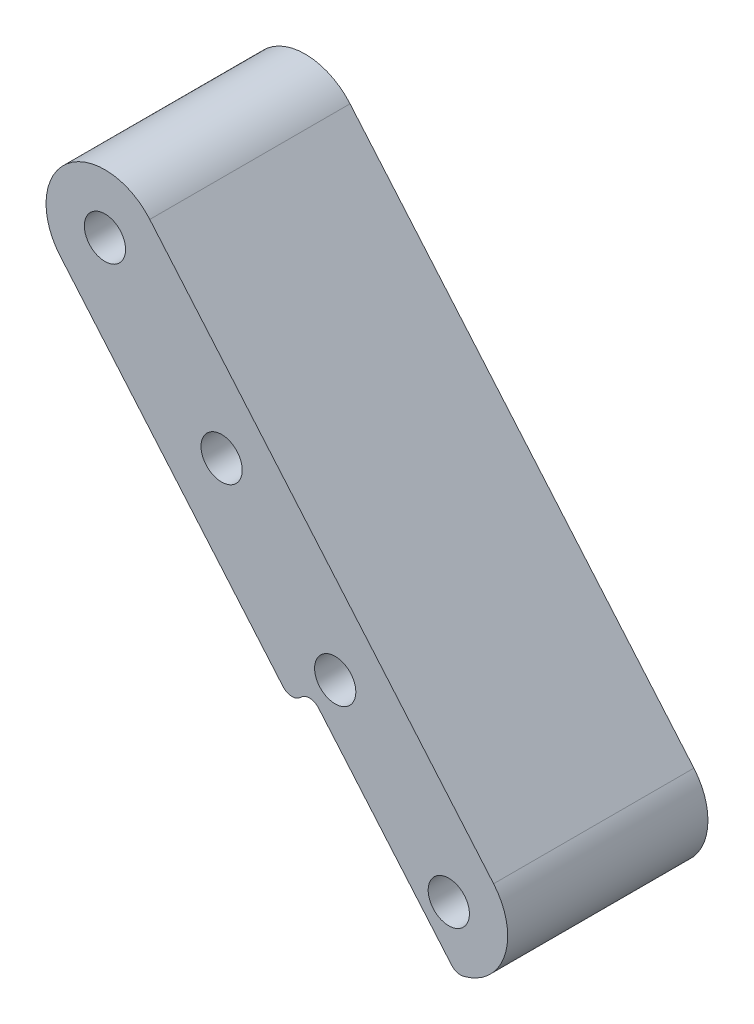
ISO-10303-21;
HEADER;
FILE_DESCRIPTION(('STEP AP214'),'2;1');
FILE_NAME('part.step','',(''),(''),'','','');
FILE_SCHEMA(('AUTOMOTIVE_DESIGN { 1 0 10303 214 1 1 1 1 }'));
ENDSEC;
DATA;
#1=APPLICATION_CONTEXT('core data for automotive mechanical design processes');
#2=APPLICATION_PROTOCOL_DEFINITION('international standard','automotive_design',2000,#1);
#3=PRODUCT_CONTEXT('',#1,'mechanical');
#4=PRODUCT('Part','Part','',(#3));
#5=PRODUCT_RELATED_PRODUCT_CATEGORY('part','',(#4));
#6=PRODUCT_DEFINITION_FORMATION('','',#4);
#7=PRODUCT_DEFINITION_CONTEXT('part definition',#1,'design');
#8=PRODUCT_DEFINITION('design','',#6,#7);
#9=PRODUCT_DEFINITION_SHAPE('','',#8);
#10=(LENGTH_UNIT() NAMED_UNIT(*) SI_UNIT(.MILLI.,.METRE.));
#11=(NAMED_UNIT(*) PLANE_ANGLE_UNIT() SI_UNIT($,.RADIAN.));
#12=(NAMED_UNIT(*) SI_UNIT($,.STERADIAN.) SOLID_ANGLE_UNIT());
#13=UNCERTAINTY_MEASURE_WITH_UNIT(LENGTH_MEASURE(1.E-05),#10,'distance_accuracy_value','');
#14=(GEOMETRIC_REPRESENTATION_CONTEXT(3) GLOBAL_UNCERTAINTY_ASSIGNED_CONTEXT((#13)) GLOBAL_UNIT_ASSIGNED_CONTEXT((#10,
#11,#12)) REPRESENTATION_CONTEXT('',''));
#15=CARTESIAN_POINT('',(0.,0.,0.));
#16=DIRECTION('',(0.,0.,1.));
#17=DIRECTION('',(1.,0.,0.));
#18=AXIS2_PLACEMENT_3D('',#15,#16,#17);
#19=CARTESIAN_POINT('',(-10.203207624469,-8.69654423782736,-34.));
#20=DIRECTION('',(0.761061934171293,0.648679221461156,0.));
#21=DIRECTION('',(-0.648679221461156,0.761061934171293,0.));
#22=AXIS2_PLACEMENT_3D('',#19,#20,#21);
#23=PLANE('',#22);
#24=DIRECTION('',(0.648679221461156,-0.761061934171293,0.));
#25=VECTOR('',#24,1.);
#26=CARTESIAN_POINT('',(-10.203207624469,-8.69654423782736,0.));
#27=LINE('',#26,#25);
#28=CARTESIAN_POINT('',(26.1104587089052,-51.301499386963,0.));
#29=VERTEX_POINT('',#28);
#30=CARTESIAN_POINT('',(63.9584834494717,-95.7066382608978,0.));
#31=VERTEX_POINT('',#30);
#32=EDGE_CURVE('E179',#29,#31,#27,.T.);
#33=ORIENTED_EDGE('',*,*,#32,.F.);
#34=DIRECTION('',(0.,0.,1.));
#35=VECTOR('',#34,1.);
#36=CARTESIAN_POINT('',(26.1104587089052,-51.301499386963,-34.));
#37=LINE('',#36,#35);
#38=CARTESIAN_POINT('',(26.1104587089052,-51.301499386963,-34.));
#39=VERTEX_POINT('',#38);
#40=EDGE_CURVE('E162',#39,#29,#37,.T.);
#41=ORIENTED_EDGE('',*,*,#40,.F.);
#42=DIRECTION('',(0.648679221461156,-0.761061934171293,0.));
#43=VECTOR('',#42,1.);
#44=CARTESIAN_POINT('',(-10.203207624469,-8.69654423782736,-34.));
#45=LINE('',#44,#43);
#46=CARTESIAN_POINT('',(63.9584834494717,-95.7066382608978,-34.));
#47=VERTEX_POINT('',#46);
#48=EDGE_CURVE('E150',#39,#47,#45,.T.);
#49=ORIENTED_EDGE('',*,*,#48,.T.);
#50=DIRECTION('',(0.,0.,-1.));
#51=VECTOR('',#50,1.);
#52=CARTESIAN_POINT('',(63.9584834494717,-95.7066382608978,-34.));
#53=LINE('',#52,#51);
#54=EDGE_CURVE('E142',#31,#47,#53,.T.);
#55=ORIENTED_EDGE('',*,*,#54,.F.);
#56=EDGE_LOOP('',(#33,#41,#49,#55));
#57=FACE_BOUND('',#56,.T.);
#58=ADVANCED_FACE('F47',(#57),#23,.F.);
#59=CARTESIAN_POINT('',(92.0987320713913,-113.30620314066,-34.));
#60=DIRECTION('',(0.,0.,1.));
#61=DIRECTION('',(-1.,0.,0.));
#62=AXIS2_PLACEMENT_3D('',#59,#60,#61);
#63=CYLINDRICAL_SURFACE('',#62,9.99999999999999);
#64=CARTESIAN_POINT('',(92.0987320713913,-113.30620314066,-34.));
#65=DIRECTION('',(0.,0.,1.));
#66=DIRECTION('',(1.,0.,0.));
#67=AXIS2_PLACEMENT_3D('',#64,#65,#66);
#68=CIRCLE('',#67,9.99999999999999);
#69=CARTESIAN_POINT('',(94.6021290946444,-122.98778376285,-34.));
#70=VERTEX_POINT('',#69);
#71=CARTESIAN_POINT('',(99.7093514131042,-106.819410926048,-34.));
#72=VERTEX_POINT('',#71);
#73=EDGE_CURVE('E126',#70,#72,#68,.T.);
#74=ORIENTED_EDGE('',*,*,#73,.T.);
#75=DIRECTION('',(0.,0.,1.));
#76=VECTOR('',#75,1.);
#77=CARTESIAN_POINT('',(99.7093514131042,-106.819410926048,-34.));
#78=LINE('',#77,#76);
#79=CARTESIAN_POINT('',(99.7093514131042,-106.819410926048,0.));
#80=VERTEX_POINT('',#79);
#81=EDGE_CURVE('E134',#72,#80,#78,.T.);
#82=ORIENTED_EDGE('',*,*,#81,.T.);
#83=CARTESIAN_POINT('',(92.0987320713913,-113.30620314066,0.));
#84=DIRECTION('',(0.,0.,1.));
#85=DIRECTION('',(1.,0.,0.));
#86=AXIS2_PLACEMENT_3D('',#83,#84,#85);
#87=CIRCLE('',#86,9.99999999999999);
#88=CARTESIAN_POINT('',(94.6021290946444,-122.98778376285,0.));
#89=VERTEX_POINT('',#88);
#90=EDGE_CURVE('E183',#89,#80,#87,.T.);
#91=ORIENTED_EDGE('',*,*,#90,.F.);
#92=DIRECTION('',(0.,0.,1.));
#93=VECTOR('',#92,1.);
#94=CARTESIAN_POINT('',(94.6021290946444,-122.98778376285,-34.));
#95=LINE('',#94,#93);
#96=EDGE_CURVE('E148',#70,#89,#95,.T.);
#97=ORIENTED_EDGE('',*,*,#96,.F.);
#98=EDGE_LOOP('',(#74,#82,#91,#97));
#99=FACE_BOUND('',#98,.T.);
#100=ADVANCED_FACE('F146',(#99),#63,.T.);
#101=CARTESIAN_POINT('',(5.01803105895681,4.27704019139575,-34.));
#102=DIRECTION('',(0.761061934171293,0.648679221461156,0.));
#103=DIRECTION('',(-0.648679221461156,0.761061934171293,0.));
#104=AXIS2_PLACEMENT_3D('',#101,#102,#103);
#105=PLANE('',#104);
#106=DIRECTION('',(0.648679221461156,-0.761061934171293,0.));
#107=VECTOR('',#106,1.);
#108=CARTESIAN_POINT('',(5.01803105895681,4.27704019139575,0.));
#109=LINE('',#108,#107);
#110=CARTESIAN_POINT('',(41.3316973923311,-38.3279149577399,0.));
#111=VERTEX_POINT('',#110);
#112=EDGE_CURVE('E137',#111,#80,#109,.T.);
#113=ORIENTED_EDGE('',*,*,#112,.T.);
#114=ORIENTED_EDGE('',*,*,#81,.F.);
#115=DIRECTION('',(0.648679221461156,-0.761061934171293,0.));
#116=VECTOR('',#115,1.);
#117=CARTESIAN_POINT('',(5.01803105895681,4.27704019139575,-34.));
#118=LINE('',#117,#116);
#119=CARTESIAN_POINT('',(41.3316973923311,-38.3279149577399,-34.));
#120=VERTEX_POINT('',#119);
#121=EDGE_CURVE('E119',#120,#72,#118,.T.);
#122=ORIENTED_EDGE('',*,*,#121,.F.);
#123=DIRECTION('',(0.,0.,1.));
#124=VECTOR('',#123,1.);
#125=CARTESIAN_POINT('',(41.3316973923311,-38.3279149577399,-34.));
#126=LINE('',#125,#124);
#127=EDGE_CURVE('E143',#120,#111,#126,.T.);
#128=ORIENTED_EDGE('',*,*,#127,.T.);
#129=EDGE_LOOP('',(#113,#114,#122,#128));
#130=FACE_BOUND('',#129,.T.);
#131=ADVANCED_FACE('F135',(#130),#105,.T.);
#132=CARTESIAN_POINT('',(33.7210780506182,-44.8147071723515,-34.));
#133=DIRECTION('',(0.,0.,1.));
#134=DIRECTION('',(-1.,0.,0.));
#135=AXIS2_PLACEMENT_3D('',#132,#133,#134);
#136=CYLINDRICAL_SURFACE('',#135,3.5);
#137=CARTESIAN_POINT('',(33.7210780506182,-44.8147071723515,-34.));
#138=DIRECTION('',(0.,0.,1.));
#139=DIRECTION('',(1.,0.,0.));
#140=AXIS2_PLACEMENT_3D('',#137,#138,#139);
#141=CIRCLE('',#140,3.5);
#142=CARTESIAN_POINT('',(37.2210780506182,-44.8147071723515,-34.));
#143=VERTEX_POINT('',#142);
#144=EDGE_CURVE('E156',#143,#143,#141,.T.);
#145=ORIENTED_EDGE('',*,*,#144,.F.);
#146=EDGE_LOOP('',(#145));
#147=FACE_BOUND('',#146,.T.);
#148=CARTESIAN_POINT('',(33.7210780506182,-44.8147071723515,0.));
#149=DIRECTION('',(0.,0.,1.));
#150=DIRECTION('',(1.,0.,0.));
#151=AXIS2_PLACEMENT_3D('',#148,#149,#150);
#152=CIRCLE('',#151,3.5);
#153=CARTESIAN_POINT('',(37.2210780506182,-44.8147071723515,0.));
#154=VERTEX_POINT('',#153);
#155=EDGE_CURVE('E175',#154,#154,#152,.T.);
#156=ORIENTED_EDGE('',*,*,#155,.T.);
#157=EDGE_LOOP('',(#156));
#158=FACE_BOUND('',#157,.T.);
#159=ADVANCED_FACE('F254',(#147,#158),#136,.F.);
#160=CARTESIAN_POINT('',(53.5314754901986,-67.3435365535214,-34.));
#161=DIRECTION('',(0.,0.,1.));
#162=DIRECTION('',(-1.,0.,0.));
#163=AXIS2_PLACEMENT_3D('',#160,#161,#162);
#164=CYLINDRICAL_SURFACE('',#163,3.5);
#165=CARTESIAN_POINT('',(53.5314754901986,-67.3435365535214,-34.));
#166=DIRECTION('',(0.,0.,1.));
#167=DIRECTION('',(1.,0.,0.));
#168=AXIS2_PLACEMENT_3D('',#165,#166,#167);
#169=CIRCLE('',#168,3.5);
#170=CARTESIAN_POINT('',(57.0314754901986,-67.3435365535214,-34.));
#171=VERTEX_POINT('',#170);
#172=EDGE_CURVE('E246',#171,#171,#169,.T.);
#173=ORIENTED_EDGE('',*,*,#172,.F.);
#174=EDGE_LOOP('',(#173));
#175=FACE_BOUND('',#174,.T.);
#176=CARTESIAN_POINT('',(53.5314754901986,-67.3435365535214,0.));
#177=DIRECTION('',(0.,0.,1.));
#178=DIRECTION('',(1.,0.,0.));
#179=AXIS2_PLACEMENT_3D('',#176,#177,#178);
#180=CIRCLE('',#179,3.5);
#181=CARTESIAN_POINT('',(57.0314754901986,-67.3435365535214,0.));
#182=VERTEX_POINT('',#181);
#183=EDGE_CURVE('E172',#182,#182,#180,.T.);
#184=ORIENTED_EDGE('',*,*,#183,.T.);
#185=EDGE_LOOP('',(#184));
#186=FACE_BOUND('',#185,.T.);
#187=ADVANCED_FACE('F257',(#175,#186),#164,.F.);
#188=CARTESIAN_POINT('',(92.0987320713913,-113.30620314066,-34.));
#189=DIRECTION('',(0.,0.,1.));
#190=DIRECTION('',(-1.,0.,0.));
#191=AXIS2_PLACEMENT_3D('',#188,#189,#190);
#192=CYLINDRICAL_SURFACE('',#191,3.50000000000001);
#193=CARTESIAN_POINT('',(92.0987320713913,-113.30620314066,-34.));
#194=DIRECTION('',(0.,0.,1.));
#195=DIRECTION('',(1.,0.,0.));
#196=AXIS2_PLACEMENT_3D('',#193,#194,#195);
#197=CIRCLE('',#196,3.50000000000001);
#198=CARTESIAN_POINT('',(95.5987320713913,-113.30620314066,-34.));
#199=VERTEX_POINT('',#198);
#200=EDGE_CURVE('E242',#199,#199,#197,.T.);
#201=ORIENTED_EDGE('',*,*,#200,.F.);
#202=EDGE_LOOP('',(#201));
#203=FACE_BOUND('',#202,.T.);
#204=CARTESIAN_POINT('',(92.0987320713913,-113.30620314066,0.));
#205=DIRECTION('',(0.,0.,1.));
#206=DIRECTION('',(1.,0.,0.));
#207=AXIS2_PLACEMENT_3D('',#204,#205,#206);
#208=CIRCLE('',#207,3.50000000000001);
#209=CARTESIAN_POINT('',(95.5987320713913,-113.30620314066,0.));
#210=VERTEX_POINT('',#209);
#211=EDGE_CURVE('E167',#210,#210,#208,.T.);
#212=ORIENTED_EDGE('',*,*,#211,.T.);
#213=EDGE_LOOP('',(#212));
#214=FACE_BOUND('',#213,.T.);
#215=ADVANCED_FACE('F297',(#203,#214),#192,.F.);
#216=CARTESIAN_POINT('',(72.8151037807949,-90.3248698470906,-34.));
#217=DIRECTION('',(0.,0.,1.));
#218=DIRECTION('',(-1.,0.,0.));
#219=AXIS2_PLACEMENT_3D('',#216,#217,#218);
#220=CYLINDRICAL_SURFACE('',#219,3.50000000000001);
#221=CARTESIAN_POINT('',(72.8151037807949,-90.3248698470906,-34.));
#222=DIRECTION('',(0.,0.,1.));
#223=DIRECTION('',(1.,0.,0.));
#224=AXIS2_PLACEMENT_3D('',#221,#222,#223);
#225=CIRCLE('',#224,3.50000000000001);
#226=CARTESIAN_POINT('',(76.315103780795,-90.3248698470906,-34.));
#227=VERTEX_POINT('',#226);
#228=EDGE_CURVE('E191',#227,#227,#225,.T.);
#229=ORIENTED_EDGE('',*,*,#228,.F.);
#230=EDGE_LOOP('',(#229));
#231=FACE_BOUND('',#230,.T.);
#232=CARTESIAN_POINT('',(72.8151037807949,-90.3248698470906,0.));
#233=DIRECTION('',(0.,0.,1.));
#234=DIRECTION('',(1.,0.,0.));
#235=AXIS2_PLACEMENT_3D('',#232,#233,#234);
#236=CIRCLE('',#235,3.50000000000001);
#237=CARTESIAN_POINT('',(76.315103780795,-90.3248698470906,0.));
#238=VERTEX_POINT('',#237);
#239=EDGE_CURVE('E163',#238,#238,#236,.T.);
#240=ORIENTED_EDGE('',*,*,#239,.T.);
#241=EDGE_LOOP('',(#240));
#242=FACE_BOUND('',#241,.T.);
#243=ADVANCED_FACE('F301',(#231,#242),#220,.F.);
#244=CARTESIAN_POINT('',(33.7210780506182,-44.8147071723515,-34.));
#245=DIRECTION('',(0.,0.,1.));
#246=DIRECTION('',(-1.,0.,0.));
#247=AXIS2_PLACEMENT_3D('',#244,#245,#246);
#248=CYLINDRICAL_SURFACE('',#247,10.);
#249=CARTESIAN_POINT('',(33.7210780506182,-44.8147071723515,0.));
#250=DIRECTION('',(0.,0.,1.));
#251=DIRECTION('',(1.,0.,0.));
#252=AXIS2_PLACEMENT_3D('',#249,#250,#251);
#253=CIRCLE('',#252,10.);
#254=EDGE_CURVE('E188',#111,#29,#253,.T.);
#255=ORIENTED_EDGE('',*,*,#254,.F.);
#256=ORIENTED_EDGE('',*,*,#127,.F.);
#257=CARTESIAN_POINT('',(33.7210780506182,-44.8147071723515,-34.));
#258=DIRECTION('',(0.,0.,1.));
#259=DIRECTION('',(1.,0.,0.));
#260=AXIS2_PLACEMENT_3D('',#257,#258,#259);
#261=CIRCLE('',#260,10.);
#262=EDGE_CURVE('E127',#120,#39,#261,.T.);
#263=ORIENTED_EDGE('',*,*,#262,.T.);
#264=ORIENTED_EDGE('',*,*,#40,.T.);
#265=EDGE_LOOP('',(#255,#256,#263,#264));
#266=FACE_BOUND('',#265,.T.);
#267=ADVANCED_FACE('F304',(#266),#248,.T.);
#268=CARTESIAN_POINT('',(0.,0.,-34.));
#269=DIRECTION('',(0.,0.,-1.));
#270=DIRECTION('',(1.,0.,0.));
#271=AXIS2_PLACEMENT_3D('',#268,#269,#270);
#272=PLANE('',#271);
#273=ORIENTED_EDGE('',*,*,#48,.F.);
#274=ORIENTED_EDGE('',*,*,#262,.F.);
#275=ORIENTED_EDGE('',*,*,#121,.T.);
#276=ORIENTED_EDGE('',*,*,#73,.F.);
#277=CARTESIAN_POINT('',(94.1014496899938,-121.051467638412,-34.));
#278=DIRECTION('',(0.,0.,1.));
#279=DIRECTION('',(1.,0.,0.));
#280=AXIS2_PLACEMENT_3D('',#277,#278,#279);
#281=CIRCLE('',#280,2.);
#282=CARTESIAN_POINT('',(92.5793258216512,-122.348826081334,-34.));
#283=VERTEX_POINT('',#282);
#284=EDGE_CURVE('E200',#283,#70,#281,.T.);
#285=ORIENTED_EDGE('',*,*,#284,.F.);
#286=DIRECTION('',(-0.648679221461155,0.761061934171293,0.));
#287=VECTOR('',#286,1.);
#288=CARTESIAN_POINT('',(-6.77842892069819,-5.77748774125213,-34.));
#289=LINE('',#288,#287);
#290=CARTESIAN_POINT('',(69.9779790390872,-95.8318295010078,-34.));
#291=VERTEX_POINT('',#290);
#292=EDGE_CURVE('E229',#283,#291,#289,.T.);
#293=ORIENTED_EDGE('',*,*,#292,.T.);
#294=CARTESIAN_POINT('',(68.4558551707446,-97.1291879439301,-34.));
#295=DIRECTION('',(0.,0.,1.));
#296=DIRECTION('',(1.,0.,0.));
#297=AXIS2_PLACEMENT_3D('',#294,#295,#296);
#298=CIRCLE('',#297,2.);
#299=CARTESIAN_POINT('',(67.1584967278223,-95.6070640755875,-34.));
#300=VERTEX_POINT('',#299);
#301=EDGE_CURVE('E56',#300,#291,#298,.F.);
#302=ORIENTED_EDGE('',*,*,#301,.F.);
#303=DIRECTION('',(-0.761061934171289,-0.64867922146116,0.));
#304=VECTOR('',#303,1.);
#305=CARTESIAN_POINT('',(75.4590495168636,-88.5322178914125,-34.));
#306=LINE('',#305,#304);
#307=CARTESIAN_POINT('',(66.7779657607366,-95.9314036863181,-34.));
#308=VERTEX_POINT('',#307);
#309=EDGE_CURVE('E231',#300,#308,#306,.T.);
#310=ORIENTED_EDGE('',*,*,#309,.T.);
#311=CARTESIAN_POINT('',(65.4806073178143,-94.4092798179755,-34.));
#312=DIRECTION('',(0.,0.,1.));
#313=DIRECTION('',(1.,0.,0.));
#314=AXIS2_PLACEMENT_3D('',#311,#312,#313);
#315=CIRCLE('',#314,2.);
#316=EDGE_CURVE('E203',#47,#308,#315,.T.);
#317=ORIENTED_EDGE('',*,*,#316,.F.);
#318=EDGE_LOOP('',(#273,#274,#275,#276,#285,#293,#302,#310,#317));
#319=FACE_BOUND('',#318,.T.);
#320=ORIENTED_EDGE('',*,*,#228,.T.);
#321=EDGE_LOOP('',(#320));
#322=FACE_BOUND('',#321,.T.);
#323=ORIENTED_EDGE('',*,*,#200,.T.);
#324=EDGE_LOOP('',(#323));
#325=FACE_BOUND('',#324,.T.);
#326=ORIENTED_EDGE('',*,*,#172,.T.);
#327=EDGE_LOOP('',(#326));
#328=FACE_BOUND('',#327,.T.);
#329=ORIENTED_EDGE('',*,*,#144,.T.);
#330=EDGE_LOOP('',(#329));
#331=FACE_BOUND('',#330,.T.);
#332=ADVANCED_FACE('F122',(#319,#322,#325,#328,#331),#272,.T.);
#333=CARTESIAN_POINT('',(0.,0.,0.));
#334=DIRECTION('',(0.,0.,-1.));
#335=DIRECTION('',(1.,0.,0.));
#336=AXIS2_PLACEMENT_3D('',#333,#334,#335);
#337=PLANE('',#336);
#338=ORIENTED_EDGE('',*,*,#239,.F.);
#339=EDGE_LOOP('',(#338));
#340=FACE_BOUND('',#339,.T.);
#341=ORIENTED_EDGE('',*,*,#211,.F.);
#342=EDGE_LOOP('',(#341));
#343=FACE_BOUND('',#342,.T.);
#344=ORIENTED_EDGE('',*,*,#183,.F.);
#345=EDGE_LOOP('',(#344));
#346=FACE_BOUND('',#345,.T.);
#347=ORIENTED_EDGE('',*,*,#155,.F.);
#348=EDGE_LOOP('',(#347));
#349=FACE_BOUND('',#348,.T.);
#350=DIRECTION('',(-0.761061934171289,-0.64867922146116,0.));
#351=VECTOR('',#350,1.);
#352=CARTESIAN_POINT('',(75.4590495168636,-88.5322178914125,0.));
#353=LINE('',#352,#351);
#354=CARTESIAN_POINT('',(67.1584967278223,-95.6070640755875,0.));
#355=VERTEX_POINT('',#354);
#356=CARTESIAN_POINT('',(66.7779657607366,-95.9314036863181,0.));
#357=VERTEX_POINT('',#356);
#358=EDGE_CURVE('E168',#355,#357,#353,.T.);
#359=ORIENTED_EDGE('',*,*,#358,.F.);
#360=CARTESIAN_POINT('',(68.4558551707446,-97.1291879439301,0.));
#361=DIRECTION('',(0.,0.,1.));
#362=DIRECTION('',(1.,0.,0.));
#363=AXIS2_PLACEMENT_3D('',#360,#361,#362);
#364=CIRCLE('',#363,2.);
#365=CARTESIAN_POINT('',(69.9779790390872,-95.8318295010078,0.));
#366=VERTEX_POINT('',#365);
#367=EDGE_CURVE('E11',#366,#355,#364,.T.);
#368=ORIENTED_EDGE('',*,*,#367,.F.);
#369=DIRECTION('',(-0.648679221461155,0.761061934171293,0.));
#370=VECTOR('',#369,1.);
#371=CARTESIAN_POINT('',(-6.77842892069819,-5.77748774125213,0.));
#372=LINE('',#371,#370);
#373=CARTESIAN_POINT('',(92.5793258216512,-122.348826081334,0.));
#374=VERTEX_POINT('',#373);
#375=EDGE_CURVE('E234',#374,#366,#372,.T.);
#376=ORIENTED_EDGE('',*,*,#375,.F.);
#377=CARTESIAN_POINT('',(94.1014496899938,-121.051467638412,0.));
#378=DIRECTION('',(0.,0.,1.));
#379=DIRECTION('',(1.,0.,0.));
#380=AXIS2_PLACEMENT_3D('',#377,#378,#379);
#381=CIRCLE('',#380,2.);
#382=EDGE_CURVE('E212',#89,#374,#381,.F.);
#383=ORIENTED_EDGE('',*,*,#382,.F.);
#384=ORIENTED_EDGE('',*,*,#90,.T.);
#385=ORIENTED_EDGE('',*,*,#112,.F.);
#386=ORIENTED_EDGE('',*,*,#254,.T.);
#387=ORIENTED_EDGE('',*,*,#32,.T.);
#388=CARTESIAN_POINT('',(65.4806073178143,-94.4092798179755,0.));
#389=DIRECTION('',(0.,0.,1.));
#390=DIRECTION('',(1.,0.,0.));
#391=AXIS2_PLACEMENT_3D('',#388,#389,#390);
#392=CIRCLE('',#391,2.);
#393=EDGE_CURVE('E215',#357,#31,#392,.F.);
#394=ORIENTED_EDGE('',*,*,#393,.F.);
#395=EDGE_LOOP('',(#359,#368,#376,#383,#384,#385,#386,#387,#394));
#396=FACE_BOUND('',#395,.T.);
#397=ADVANCED_FACE('F261',(#340,#343,#346,#349,#396),#337,.F.);
#398=CARTESIAN_POINT('',(-6.77842892069819,-5.77748774125213,0.));
#399=DIRECTION('',(0.761061934171293,0.648679221461155,0.));
#400=DIRECTION('',(-0.648679221461155,0.761061934171293,0.));
#401=AXIS2_PLACEMENT_3D('',#398,#399,#400);
#402=PLANE('',#401);
#403=ORIENTED_EDGE('',*,*,#375,.T.);
#404=DIRECTION('',(0.,0.,-1.));
#405=VECTOR('',#404,1.);
#406=CARTESIAN_POINT('',(69.9779790390872,-95.8318295010078,0.));
#407=LINE('',#406,#405);
#408=EDGE_CURVE('E62',#291,#366,#407,.F.);
#409=ORIENTED_EDGE('',*,*,#408,.F.);
#410=ORIENTED_EDGE('',*,*,#292,.F.);
#411=DIRECTION('',(0.,0.,1.));
#412=VECTOR('',#411,1.);
#413=CARTESIAN_POINT('',(92.5793258216512,-122.348826081334,0.));
#414=LINE('',#413,#412);
#415=EDGE_CURVE('E69',#374,#283,#414,.F.);
#416=ORIENTED_EDGE('',*,*,#415,.F.);
#417=EDGE_LOOP('',(#403,#409,#410,#416));
#418=FACE_BOUND('',#417,.T.);
#419=ADVANCED_FACE('F264',(#418),#402,.F.);
#420=CARTESIAN_POINT('',(75.4590495168636,-88.5322178914125,0.));
#421=DIRECTION('',(-0.64867922146116,0.761061934171289,0.));
#422=DIRECTION('',(-0.761061934171289,-0.64867922146116,0.));
#423=AXIS2_PLACEMENT_3D('',#420,#421,#422);
#424=PLANE('',#423);
#425=ORIENTED_EDGE('',*,*,#309,.F.);
#426=DIRECTION('',(0.,0.,-1.));
#427=VECTOR('',#426,1.);
#428=CARTESIAN_POINT('',(67.1584967278223,-95.6070640755875,-34.));
#429=LINE('',#428,#427);
#430=EDGE_CURVE('E207',#355,#300,#429,.T.);
#431=ORIENTED_EDGE('',*,*,#430,.F.);
#432=ORIENTED_EDGE('',*,*,#358,.T.);
#433=DIRECTION('',(0.,0.,-1.));
#434=VECTOR('',#433,1.);
#435=CARTESIAN_POINT('',(66.7779657607366,-95.9314036863181,0.));
#436=LINE('',#435,#434);
#437=EDGE_CURVE('E210',#308,#357,#436,.F.);
#438=ORIENTED_EDGE('',*,*,#437,.F.);
#439=EDGE_LOOP('',(#425,#431,#432,#438));
#440=FACE_BOUND('',#439,.T.);
#441=ADVANCED_FACE('F282',(#440),#424,.F.);
#442=CARTESIAN_POINT('',(65.4806073178143,-94.4092798179755,-34.));
#443=DIRECTION('',(0.,0.,-1.));
#444=DIRECTION('',(1.,0.,0.));
#445=AXIS2_PLACEMENT_3D('',#442,#443,#444);
#446=CYLINDRICAL_SURFACE('',#445,2.);
#447=ORIENTED_EDGE('',*,*,#393,.T.);
#448=ORIENTED_EDGE('',*,*,#54,.T.);
#449=ORIENTED_EDGE('',*,*,#316,.T.);
#450=ORIENTED_EDGE('',*,*,#437,.T.);
#451=EDGE_LOOP('',(#447,#448,#449,#450));
#452=FACE_BOUND('',#451,.T.);
#453=ADVANCED_FACE('F277',(#452),#446,.T.);
#454=CARTESIAN_POINT('',(94.1014496899938,-121.051467638412,-34.));
#455=DIRECTION('',(0.,0.,1.));
#456=DIRECTION('',(-1.,0.,0.));
#457=AXIS2_PLACEMENT_3D('',#454,#455,#456);
#458=CYLINDRICAL_SURFACE('',#457,2.);
#459=ORIENTED_EDGE('',*,*,#382,.T.);
#460=ORIENTED_EDGE('',*,*,#415,.T.);
#461=ORIENTED_EDGE('',*,*,#284,.T.);
#462=ORIENTED_EDGE('',*,*,#96,.T.);
#463=EDGE_LOOP('',(#459,#460,#461,#462));
#464=FACE_BOUND('',#463,.T.);
#465=ADVANCED_FACE('F275',(#464),#458,.T.);
#466=CARTESIAN_POINT('',(68.4558551707446,-97.1291879439301,0.));
#467=DIRECTION('',(0.,0.,1.));
#468=DIRECTION('',(-1.,0.,0.));
#469=AXIS2_PLACEMENT_3D('',#466,#467,#468);
#470=CYLINDRICAL_SURFACE('',#469,2.);
#471=ORIENTED_EDGE('',*,*,#367,.T.);
#472=ORIENTED_EDGE('',*,*,#430,.T.);
#473=ORIENTED_EDGE('',*,*,#301,.T.);
#474=ORIENTED_EDGE('',*,*,#408,.T.);
#475=EDGE_LOOP('',(#471,#472,#473,#474));
#476=FACE_BOUND('',#475,.T.);
#477=ADVANCED_FACE('F49',(#476),#470,.F.);
#478=CLOSED_SHELL('',(#58,#100,#131,#159,#187,#215,#243,#267,#332,#397,#419,#441,#453,#465,#477));
#479=MANIFOLD_SOLID_BREP('B2',#478);
#480=ADVANCED_BREP_SHAPE_REPRESENTATION('',(#18,#479),#14);
#481=SHAPE_DEFINITION_REPRESENTATION(#9,#480);
ENDSEC;
END-ISO-10303-21;
